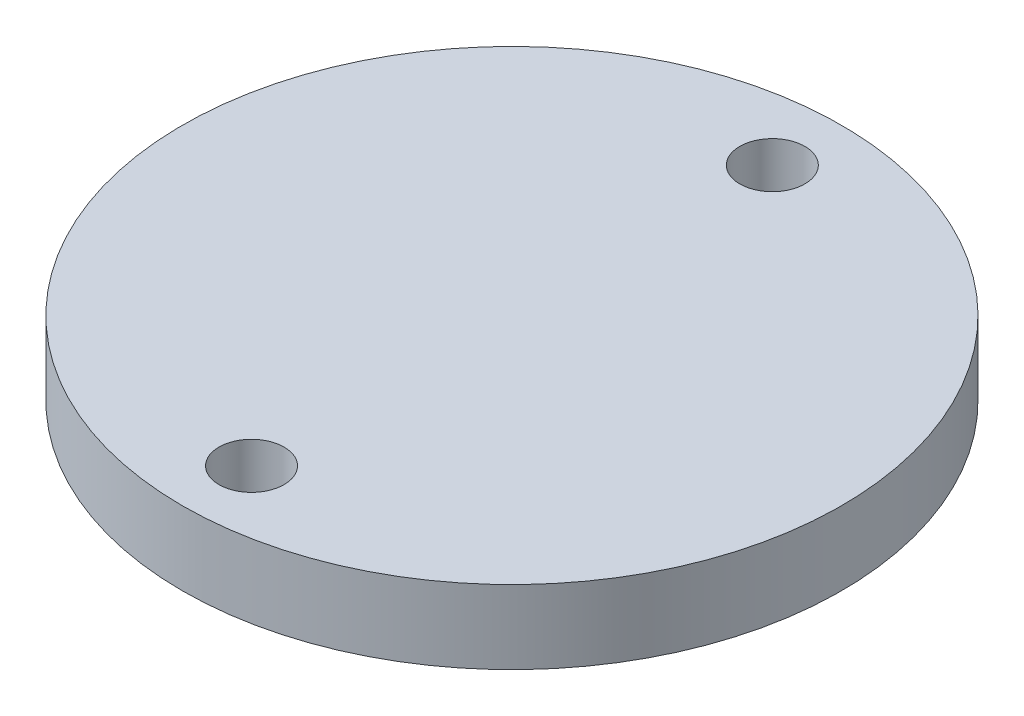
ISO-10303-21;
HEADER;
FILE_DESCRIPTION(('STEP AP214'),'2;1');
FILE_NAME('part.step','',(''),(''),'','','');
FILE_SCHEMA(('AUTOMOTIVE_DESIGN { 1 0 10303 214 1 1 1 1 }'));
ENDSEC;
DATA;
#1=APPLICATION_CONTEXT('core data for automotive mechanical design processes');
#2=APPLICATION_PROTOCOL_DEFINITION('international standard','automotive_design',2000,#1);
#3=PRODUCT_CONTEXT('',#1,'mechanical');
#4=PRODUCT('Part','Part','',(#3));
#5=PRODUCT_RELATED_PRODUCT_CATEGORY('part','',(#4));
#6=PRODUCT_DEFINITION_FORMATION('','',#4);
#7=PRODUCT_DEFINITION_CONTEXT('part definition',#1,'design');
#8=PRODUCT_DEFINITION('design','',#6,#7);
#9=PRODUCT_DEFINITION_SHAPE('','',#8);
#10=(LENGTH_UNIT() NAMED_UNIT(*) SI_UNIT(.MILLI.,.METRE.));
#11=(NAMED_UNIT(*) PLANE_ANGLE_UNIT() SI_UNIT($,.RADIAN.));
#12=(NAMED_UNIT(*) SI_UNIT($,.STERADIAN.) SOLID_ANGLE_UNIT());
#13=UNCERTAINTY_MEASURE_WITH_UNIT(LENGTH_MEASURE(1.E-05),#10,'distance_accuracy_value','');
#14=(GEOMETRIC_REPRESENTATION_CONTEXT(3) GLOBAL_UNCERTAINTY_ASSIGNED_CONTEXT((#13)) GLOBAL_UNIT_ASSIGNED_CONTEXT((#10,
#11,#12)) REPRESENTATION_CONTEXT('',''));
#15=CARTESIAN_POINT('',(0.,0.,0.));
#16=DIRECTION('',(0.,0.,1.));
#17=DIRECTION('',(1.,0.,0.));
#18=AXIS2_PLACEMENT_3D('',#15,#16,#17);
#19=CARTESIAN_POINT('',(0.,2.3,0.));
#20=DIRECTION('',(0.,-1.,0.));
#21=DIRECTION('',(0.,0.,-1.));
#22=AXIS2_PLACEMENT_3D('',#19,#20,#21);
#23=CYLINDRICAL_SURFACE('',#22,10.287);
#24=CARTESIAN_POINT('',(0.,2.3,0.));
#25=DIRECTION('',(0.,1.,0.));
#26=DIRECTION('',(0.,0.,1.));
#27=AXIS2_PLACEMENT_3D('',#24,#25,#26);
#28=CIRCLE('',#27,10.287);
#29=CARTESIAN_POINT('',(0.,2.3,10.287));
#30=VERTEX_POINT('',#29);
#31=EDGE_CURVE('E46',#30,#30,#28,.T.);
#32=ORIENTED_EDGE('',*,*,#31,.F.);
#33=EDGE_LOOP('',(#32));
#34=FACE_BOUND('',#33,.T.);
#35=CARTESIAN_POINT('',(0.,0.,0.));
#36=DIRECTION('',(0.,1.,0.));
#37=DIRECTION('',(0.,0.,1.));
#38=AXIS2_PLACEMENT_3D('',#35,#36,#37);
#39=CIRCLE('',#38,10.287);
#40=CARTESIAN_POINT('',(0.,0.,10.287));
#41=VERTEX_POINT('',#40);
#42=EDGE_CURVE('E42',#41,#41,#39,.T.);
#43=ORIENTED_EDGE('',*,*,#42,.T.);
#44=EDGE_LOOP('',(#43));
#45=FACE_BOUND('',#44,.T.);
#46=ADVANCED_FACE('F39',(#34,#45),#23,.T.);
#47=CARTESIAN_POINT('',(0.,2.3,0.));
#48=DIRECTION('',(0.,1.,0.));
#49=DIRECTION('',(0.,0.,1.));
#50=AXIS2_PLACEMENT_3D('',#47,#48,#49);
#51=PLANE('',#50);
#52=CARTESIAN_POINT('',(0.,2.3,-8.128));
#53=DIRECTION('',(0.,1.,0.));
#54=DIRECTION('',(0.,0.,1.));
#55=AXIS2_PLACEMENT_3D('',#52,#53,#54);
#56=CIRCLE('',#55,1.016);
#57=CARTESIAN_POINT('',(0.,2.3,-7.112));
#58=VERTEX_POINT('',#57);
#59=EDGE_CURVE('E55',#58,#58,#56,.T.);
#60=ORIENTED_EDGE('',*,*,#59,.F.);
#61=EDGE_LOOP('',(#60));
#62=FACE_BOUND('',#61,.T.);
#63=CARTESIAN_POINT('',(0.,2.3,8.128));
#64=DIRECTION('',(0.,1.,0.));
#65=DIRECTION('',(0.,0.,1.));
#66=AXIS2_PLACEMENT_3D('',#63,#64,#65);
#67=CIRCLE('',#66,1.016);
#68=CARTESIAN_POINT('',(0.,2.3,9.144));
#69=VERTEX_POINT('',#68);
#70=EDGE_CURVE('E56',#69,#69,#67,.T.);
#71=ORIENTED_EDGE('',*,*,#70,.F.);
#72=EDGE_LOOP('',(#71));
#73=FACE_BOUND('',#72,.T.);
#74=ORIENTED_EDGE('',*,*,#31,.T.);
#75=EDGE_LOOP('',(#74));
#76=FACE_BOUND('',#75,.T.);
#77=ADVANCED_FACE('F78',(#62,#73,#76),#51,.T.);
#78=CARTESIAN_POINT('',(0.,0.,0.));
#79=DIRECTION('',(0.,1.,0.));
#80=DIRECTION('',(0.,0.,1.));
#81=AXIS2_PLACEMENT_3D('',#78,#79,#80);
#82=PLANE('',#81);
#83=CARTESIAN_POINT('',(0.,0.,-8.128));
#84=DIRECTION('',(0.,1.,0.));
#85=DIRECTION('',(0.,0.,1.));
#86=AXIS2_PLACEMENT_3D('',#83,#84,#85);
#87=CIRCLE('',#86,1.016);
#88=CARTESIAN_POINT('',(0.,0.,-7.112));
#89=VERTEX_POINT('',#88);
#90=EDGE_CURVE('E59',#89,#89,#87,.T.);
#91=ORIENTED_EDGE('',*,*,#90,.T.);
#92=EDGE_LOOP('',(#91));
#93=FACE_BOUND('',#92,.T.);
#94=CARTESIAN_POINT('',(0.,0.,8.128));
#95=DIRECTION('',(0.,1.,0.));
#96=DIRECTION('',(0.,0.,1.));
#97=AXIS2_PLACEMENT_3D('',#94,#95,#96);
#98=CIRCLE('',#97,1.016);
#99=CARTESIAN_POINT('',(0.,0.,9.144));
#100=VERTEX_POINT('',#99);
#101=EDGE_CURVE('E60',#100,#100,#98,.T.);
#102=ORIENTED_EDGE('',*,*,#101,.T.);
#103=EDGE_LOOP('',(#102));
#104=FACE_BOUND('',#103,.T.);
#105=CARTESIAN_POINT('',(0.,0.,0.));
#106=DIRECTION('',(0.,-1.,0.));
#107=DIRECTION('',(0.,0.,-1.));
#108=AXIS2_PLACEMENT_3D('',#105,#106,#107);
#109=CIRCLE('',#108,4.4);
#110=CARTESIAN_POINT('',(0.,0.,-4.4));
#111=VERTEX_POINT('',#110);
#112=EDGE_CURVE('E10',#111,#111,#109,.T.);
#113=ORIENTED_EDGE('',*,*,#112,.F.);
#114=EDGE_LOOP('',(#113));
#115=FACE_BOUND('',#114,.T.);
#116=ORIENTED_EDGE('',*,*,#42,.F.);
#117=EDGE_LOOP('',(#116));
#118=FACE_BOUND('',#117,.T.);
#119=ADVANCED_FACE('F68',(#93,#104,#115,#118),#82,.F.);
#120=CARTESIAN_POINT('',(0.,-3.3,0.));
#121=DIRECTION('',(0.,1.,0.));
#122=DIRECTION('',(0.,0.,1.));
#123=AXIS2_PLACEMENT_3D('',#120,#121,#122);
#124=CYLINDRICAL_SURFACE('',#123,4.4);
#125=CARTESIAN_POINT('',(0.,-3.3,0.));
#126=DIRECTION('',(0.,-1.,0.));
#127=DIRECTION('',(0.,0.,-1.));
#128=AXIS2_PLACEMENT_3D('',#125,#126,#127);
#129=CIRCLE('',#128,4.4);
#130=CARTESIAN_POINT('',(0.,-3.3,-4.4));
#131=VERTEX_POINT('',#130);
#132=EDGE_CURVE('E52',#131,#131,#129,.T.);
#133=ORIENTED_EDGE('',*,*,#132,.F.);
#134=EDGE_LOOP('',(#133));
#135=FACE_BOUND('',#134,.T.);
#136=ORIENTED_EDGE('',*,*,#112,.T.);
#137=EDGE_LOOP('',(#136));
#138=FACE_BOUND('',#137,.T.);
#139=ADVANCED_FACE('F92',(#135,#138),#124,.T.);
#140=CARTESIAN_POINT('',(0.,-3.3,0.));
#141=DIRECTION('',(0.,-1.,0.));
#142=DIRECTION('',(0.,0.,-1.));
#143=AXIS2_PLACEMENT_3D('',#140,#141,#142);
#144=PLANE('',#143);
#145=ORIENTED_EDGE('',*,*,#132,.T.);
#146=EDGE_LOOP('',(#145));
#147=FACE_BOUND('',#146,.T.);
#148=ADVANCED_FACE('F97',(#147),#144,.T.);
#149=CARTESIAN_POINT('',(0.,5.17368195874213,8.128));
#150=DIRECTION('',(0.,-1.,0.));
#151=DIRECTION('',(0.,0.,-1.));
#152=AXIS2_PLACEMENT_3D('',#149,#150,#151);
#153=CYLINDRICAL_SURFACE('',#152,1.016);
#154=ORIENTED_EDGE('',*,*,#101,.F.);
#155=EDGE_LOOP('',(#154));
#156=FACE_BOUND('',#155,.T.);
#157=ORIENTED_EDGE('',*,*,#70,.T.);
#158=EDGE_LOOP('',(#157));
#159=FACE_BOUND('',#158,.T.);
#160=ADVANCED_FACE('F74',(#156,#159),#153,.F.);
#161=CARTESIAN_POINT('',(0.,5.17368195874213,-8.128));
#162=DIRECTION('',(0.,-1.,0.));
#163=DIRECTION('',(0.,0.,-1.));
#164=AXIS2_PLACEMENT_3D('',#161,#162,#163);
#165=CYLINDRICAL_SURFACE('',#164,1.016);
#166=ORIENTED_EDGE('',*,*,#90,.F.);
#167=EDGE_LOOP('',(#166));
#168=FACE_BOUND('',#167,.T.);
#169=ORIENTED_EDGE('',*,*,#59,.T.);
#170=EDGE_LOOP('',(#169));
#171=FACE_BOUND('',#170,.T.);
#172=ADVANCED_FACE('F71',(#168,#171),#165,.F.);
#173=CLOSED_SHELL('',(#46,#77,#119,#139,#148,#160,#172));
#174=MANIFOLD_SOLID_BREP('B2',#173);
#175=ADVANCED_BREP_SHAPE_REPRESENTATION('',(#18,#174),#14);
#176=SHAPE_DEFINITION_REPRESENTATION(#9,#175);
ENDSEC;
END-ISO-10303-21;
